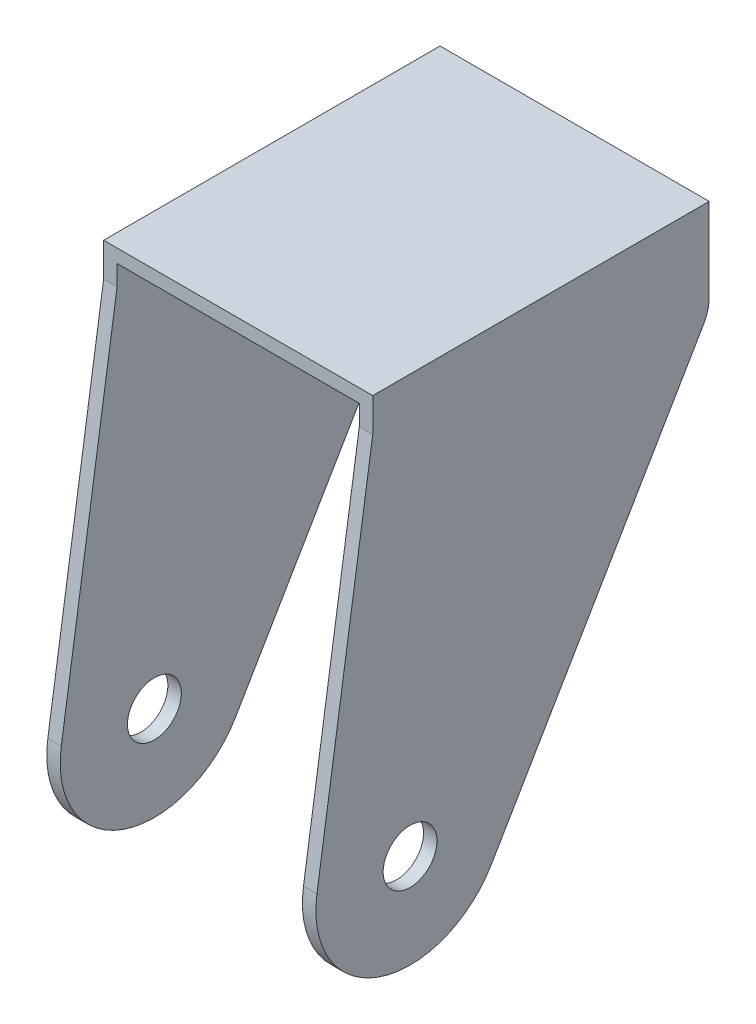
ISO-10303-21;
HEADER;
FILE_DESCRIPTION(('STEP AP214'),'2;1');
FILE_NAME('part.step','',(''),(''),'','','');
FILE_SCHEMA(('AUTOMOTIVE_DESIGN { 1 0 10303 214 1 1 1 1 }'));
ENDSEC;
DATA;
#1=APPLICATION_CONTEXT('core data for automotive mechanical design processes');
#2=APPLICATION_PROTOCOL_DEFINITION('international standard','automotive_design',2000,#1);
#3=PRODUCT_CONTEXT('',#1,'mechanical');
#4=PRODUCT('Part','Part','',(#3));
#5=PRODUCT_RELATED_PRODUCT_CATEGORY('part','',(#4));
#6=PRODUCT_DEFINITION_FORMATION('','',#4);
#7=PRODUCT_DEFINITION_CONTEXT('part definition',#1,'design');
#8=PRODUCT_DEFINITION('design','',#6,#7);
#9=PRODUCT_DEFINITION_SHAPE('','',#8);
#10=(LENGTH_UNIT() NAMED_UNIT(*) SI_UNIT(.MILLI.,.METRE.));
#11=(NAMED_UNIT(*) PLANE_ANGLE_UNIT() SI_UNIT($,.RADIAN.));
#12=(NAMED_UNIT(*) SI_UNIT($,.STERADIAN.) SOLID_ANGLE_UNIT());
#13=UNCERTAINTY_MEASURE_WITH_UNIT(LENGTH_MEASURE(1.E-05),#10,'distance_accuracy_value','');
#14=(GEOMETRIC_REPRESENTATION_CONTEXT(3) GLOBAL_UNCERTAINTY_ASSIGNED_CONTEXT((#13)) GLOBAL_UNIT_ASSIGNED_CONTEXT((#10,
#11,#12)) REPRESENTATION_CONTEXT('',''));
#15=CARTESIAN_POINT('',(0.,0.,0.));
#16=DIRECTION('',(0.,0.,1.));
#17=DIRECTION('',(1.,0.,0.));
#18=AXIS2_PLACEMENT_3D('',#15,#16,#17);
#19=CARTESIAN_POINT('',(0.,60.0885017851408,0.));
#20=DIRECTION('',(0.,1.,0.));
#21=DIRECTION('',(0.,0.,1.));
#22=AXIS2_PLACEMENT_3D('',#19,#20,#21);
#23=PLANE('',#22);
#24=DIRECTION('',(-0.466127174450924,0.,0.884717727435366));
#25=VECTOR('',#24,1.);
#26=CARTESIAN_POINT('',(-19.6951823864534,60.0885017851408,-10.3767104822299));
#27=LINE('',#26,#25);
#28=CARTESIAN_POINT('',(-9.64384241139601,60.0885017851408,-29.4543338172952));
#29=VERTEX_POINT('',#28);
#30=CARTESIAN_POINT('',(-18.,60.0885017851408,-13.5941970196715));
#31=VERTEX_POINT('',#30);
#32=EDGE_CURVE('E236',#29,#31,#27,.T.);
#33=ORIENTED_EDGE('',*,*,#32,.T.);
#34=CARTESIAN_POINT('',(-20.,60.0885017851408,-23.3921559908042));
#35=DIRECTION('',(0.,1.,0.));
#36=DIRECTION('',(0.,0.,1.));
#37=AXIS2_PLACEMENT_3D('',#34,#35,#36);
#38=CIRCLE('',#37,10.);
#39=CARTESIAN_POINT('',(-22.,60.0885017851408,-13.5941970196715));
#40=VERTEX_POINT('',#39);
#41=EDGE_CURVE('E217',#31,#40,#38,.F.);
#42=ORIENTED_EDGE('',*,*,#41,.T.);
#43=DIRECTION('',(-0.466127174450924,0.,-0.884717727435366));
#44=VECTOR('',#43,1.);
#45=CARTESIAN_POINT('',(-11.6138359030825,60.0885017851408,6.11892849681372));
#46=LINE('',#45,#44);
#47=CARTESIAN_POINT('',(-30.356157588604,60.0885017851408,-29.4543338172953));
#48=VERTEX_POINT('',#47);
#49=EDGE_CURVE('E242',#40,#48,#46,.T.);
#50=ORIENTED_EDGE('',*,*,#49,.T.);
#51=CARTESIAN_POINT('',(-20.,60.0885017851408,-23.3921559908042));
#52=DIRECTION('',(0.,1.,0.));
#53=DIRECTION('',(0.,0.,1.));
#54=AXIS2_PLACEMENT_3D('',#51,#52,#53);
#55=CIRCLE('',#54,12.);
#56=EDGE_CURVE('E239',#48,#29,#55,.T.);
#57=ORIENTED_EDGE('',*,*,#56,.T.);
#58=EDGE_LOOP('',(#33,#42,#50,#57));
#59=FACE_BOUND('',#58,.T.);
#60=DIRECTION('',(0.,0.,1.));
#61=VECTOR('',#60,1.);
#62=CARTESIAN_POINT('',(-38.,60.0885017851408,0.));
#63=LINE('',#62,#61);
#64=CARTESIAN_POINT('',(-38.,60.0885017851408,-44.4543338172952));
#65=VERTEX_POINT('',#64);
#66=CARTESIAN_POINT('',(-38.,60.0885017851408,5.54566618270477));
#67=VERTEX_POINT('',#66);
#68=EDGE_CURVE('E11',#65,#67,#63,.T.);
#69=ORIENTED_EDGE('',*,*,#68,.F.);
#70=DIRECTION('',(-1.,0.,0.));
#71=VECTOR('',#70,1.);
#72=CARTESIAN_POINT('',(-40.,60.0885017851408,-44.4543338172952));
#73=LINE('',#72,#71);
#74=CARTESIAN_POINT('',(-2.,60.0885017851408,-44.4543338172952));
#75=VERTEX_POINT('',#74);
#76=EDGE_CURVE('E178',#75,#65,#73,.T.);
#77=ORIENTED_EDGE('',*,*,#76,.F.);
#78=DIRECTION('',(0.,0.,1.));
#79=VECTOR('',#78,1.);
#80=CARTESIAN_POINT('',(-2.,60.0885017851408,0.));
#81=LINE('',#80,#79);
#82=CARTESIAN_POINT('',(-2.,60.0885017851408,5.54566618270477));
#83=VERTEX_POINT('',#82);
#84=EDGE_CURVE('E126',#75,#83,#81,.T.);
#85=ORIENTED_EDGE('',*,*,#84,.T.);
#86=DIRECTION('',(1.,0.,0.));
#87=VECTOR('',#86,1.);
#88=CARTESIAN_POINT('',(-40.,60.0885017851408,5.54566618270477));
#89=LINE('',#88,#87);
#90=EDGE_CURVE('E184',#67,#83,#89,.T.);
#91=ORIENTED_EDGE('',*,*,#90,.F.);
#92=EDGE_LOOP('',(#69,#77,#85,#91));
#93=FACE_BOUND('',#92,.T.);
#94=ADVANCED_FACE('F34',(#59,#93),#23,.F.);
#95=CARTESIAN_POINT('',(-2.,0.,0.));
#96=DIRECTION('',(1.,0.,0.));
#97=DIRECTION('',(0.,0.,-1.));
#98=AXIS2_PLACEMENT_3D('',#95,#96,#97);
#99=PLANE('',#98);
#100=CARTESIAN_POINT('',(-2.,0.,0.));
#101=DIRECTION('',(1.,0.,0.));
#102=DIRECTION('',(0.,0.,-1.));
#103=AXIS2_PLACEMENT_3D('',#100,#101,#102);
#104=CIRCLE('',#103,4.);
#105=CARTESIAN_POINT('',(-2.,0.,-4.00000000000001));
#106=VERTEX_POINT('',#105);
#107=EDGE_CURVE('E266',#106,#106,#104,.T.);
#108=ORIENTED_EDGE('',*,*,#107,.T.);
#109=EDGE_LOOP('',(#108));
#110=FACE_BOUND('',#109,.T.);
#111=ORIENTED_EDGE('',*,*,#84,.F.);
#112=DIRECTION('',(0.,1.,0.));
#113=VECTOR('',#112,1.);
#114=CARTESIAN_POINT('',(-2.,62.0885017851408,-44.4543338172952));
#115=LINE('',#114,#113);
#116=CARTESIAN_POINT('',(-2.,49.7190718356807,-44.4543338172952));
#117=VERTEX_POINT('',#116);
#118=EDGE_CURVE('E109',#117,#75,#115,.T.);
#119=ORIENTED_EDGE('',*,*,#118,.F.);
#120=CARTESIAN_POINT('',(-2.,49.7190718356807,-38.4543338172952));
#121=DIRECTION('',(1.,0.,0.));
#122=DIRECTION('',(0.,0.,1.));
#123=AXIS2_PLACEMENT_3D('',#120,#121,#122);
#124=CIRCLE('',#123,6.);
#125=CARTESIAN_POINT('',(-2.,46.6822168610769,-43.6290330223916));
#126=VERTEX_POINT('',#125);
#127=EDGE_CURVE('E123',#126,#117,#124,.T.);
#128=ORIENTED_EDGE('',*,*,#127,.F.);
#129=DIRECTION('',(0.,0.862449867516056,-0.506142495767287));
#130=VECTOR('',#129,1.);
#131=CARTESIAN_POINT('',(-2.,46.6822168610769,-43.6290330223916));
#132=LINE('',#131,#130);
#133=CARTESIAN_POINT('',(-2.,-7.08599494074203,-12.0742981452248));
#134=VERTEX_POINT('',#133);
#135=EDGE_CURVE('E130',#134,#126,#132,.T.);
#136=ORIENTED_EDGE('',*,*,#135,.F.);
#137=CARTESIAN_POINT('',(-2.,0.,0.));
#138=DIRECTION('',(1.,0.,0.));
#139=DIRECTION('',(0.,0.,-1.));
#140=AXIS2_PLACEMENT_3D('',#137,#138,#139);
#141=CIRCLE('',#140,14.);
#142=CARTESIAN_POINT('',(-2.,2.08850178514077,13.8433435373635));
#143=VERTEX_POINT('',#142);
#144=EDGE_CURVE('E132',#143,#134,#141,.T.);
#145=ORIENTED_EDGE('',*,*,#144,.F.);
#146=DIRECTION('',(0.,-0.988810252668821,0.149178698938627));
#147=VECTOR('',#146,1.);
#148=CARTESIAN_POINT('',(-2.,2.08850178514077,13.8433435373635));
#149=LINE('',#148,#147);
#150=CARTESIAN_POINT('',(-2.,57.0885017851408,5.54566618270477));
#151=VERTEX_POINT('',#150);
#152=EDGE_CURVE('E137',#151,#143,#149,.T.);
#153=ORIENTED_EDGE('',*,*,#152,.F.);
#154=DIRECTION('',(0.,-1.,0.));
#155=VECTOR('',#154,1.);
#156=CARTESIAN_POINT('',(-2.,57.0885017851408,5.54566618270477));
#157=LINE('',#156,#155);
#158=EDGE_CURVE('E127',#83,#151,#157,.T.);
#159=ORIENTED_EDGE('',*,*,#158,.F.);
#160=EDGE_LOOP('',(#111,#119,#128,#136,#145,#153,#159));
#161=FACE_BOUND('',#160,.T.);
#162=ADVANCED_FACE('F122',(#110,#161),#99,.F.);
#163=CARTESIAN_POINT('',(-2.,0.,0.));
#164=DIRECTION('',(1.,0.,0.));
#165=DIRECTION('',(0.,0.,-1.));
#166=AXIS2_PLACEMENT_3D('',#163,#164,#165);
#167=CYLINDRICAL_SURFACE('',#166,14.);
#168=CARTESIAN_POINT('',(0.,0.,0.));
#169=DIRECTION('',(1.,0.,0.));
#170=DIRECTION('',(0.,0.,-1.));
#171=AXIS2_PLACEMENT_3D('',#168,#169,#170);
#172=CIRCLE('',#171,14.);
#173=CARTESIAN_POINT('',(0.,2.08850178514077,13.8433435373635));
#174=VERTEX_POINT('',#173);
#175=CARTESIAN_POINT('',(0.,-7.08599494074203,-12.0742981452248));
#176=VERTEX_POINT('',#175);
#177=EDGE_CURVE('E139',#174,#176,#172,.T.);
#178=ORIENTED_EDGE('',*,*,#177,.F.);
#179=DIRECTION('',(1.,0.,0.));
#180=VECTOR('',#179,1.);
#181=CARTESIAN_POINT('',(-2.,2.08850178514077,13.8433435373635));
#182=LINE('',#181,#180);
#183=EDGE_CURVE('E43',#143,#174,#182,.T.);
#184=ORIENTED_EDGE('',*,*,#183,.F.);
#185=ORIENTED_EDGE('',*,*,#144,.T.);
#186=DIRECTION('',(1.,0.,0.));
#187=VECTOR('',#186,1.);
#188=CARTESIAN_POINT('',(-2.,-7.08599494074203,-12.0742981452248));
#189=LINE('',#188,#187);
#190=EDGE_CURVE('E94',#134,#176,#189,.T.);
#191=ORIENTED_EDGE('',*,*,#190,.T.);
#192=EDGE_LOOP('',(#178,#184,#185,#191));
#193=FACE_BOUND('',#192,.T.);
#194=ADVANCED_FACE('F36',(#193),#167,.T.);
#195=CARTESIAN_POINT('',(-2.,2.08850178514077,13.8433435373635));
#196=DIRECTION('',(0.,0.149178698938627,0.988810252668821));
#197=DIRECTION('',(0.,-0.988810252668821,0.149178698938627));
#198=AXIS2_PLACEMENT_3D('',#195,#196,#197);
#199=PLANE('',#198);
#200=DIRECTION('',(0.,-0.988810252668821,0.149178698938627));
#201=VECTOR('',#200,1.);
#202=CARTESIAN_POINT('',(0.,2.08850178514077,13.8433435373635));
#203=LINE('',#202,#201);
#204=CARTESIAN_POINT('',(0.,57.0885017851408,5.54566618270477));
#205=VERTEX_POINT('',#204);
#206=EDGE_CURVE('E153',#205,#174,#203,.T.);
#207=ORIENTED_EDGE('',*,*,#206,.F.);
#208=DIRECTION('',(1.,0.,0.));
#209=VECTOR('',#208,1.);
#210=CARTESIAN_POINT('',(-2.,57.0885017851408,5.54566618270477));
#211=LINE('',#210,#209);
#212=EDGE_CURVE('E157',#151,#205,#211,.T.);
#213=ORIENTED_EDGE('',*,*,#212,.F.);
#214=ORIENTED_EDGE('',*,*,#152,.T.);
#215=ORIENTED_EDGE('',*,*,#183,.T.);
#216=EDGE_LOOP('',(#207,#213,#214,#215));
#217=FACE_BOUND('',#216,.T.);
#218=ADVANCED_FACE('F169',(#217),#199,.T.);
#219=CARTESIAN_POINT('',(-2.,57.0885017851408,5.54566618270477));
#220=DIRECTION('',(0.,0.,1.));
#221=DIRECTION('',(1.,0.,0.));
#222=AXIS2_PLACEMENT_3D('',#219,#220,#221);
#223=PLANE('',#222);
#224=DIRECTION('',(0.,-1.,0.));
#225=VECTOR('',#224,1.);
#226=CARTESIAN_POINT('',(-38.,57.0885017851408,5.54566618270477));
#227=LINE('',#226,#225);
#228=CARTESIAN_POINT('',(-38.,57.0885017851408,5.54566618270477));
#229=VERTEX_POINT('',#228);
#230=EDGE_CURVE('E220',#67,#229,#227,.T.);
#231=ORIENTED_EDGE('',*,*,#230,.F.);
#232=ORIENTED_EDGE('',*,*,#90,.T.);
#233=ORIENTED_EDGE('',*,*,#158,.T.);
#234=ORIENTED_EDGE('',*,*,#212,.T.);
#235=DIRECTION('',(0.,-1.,0.));
#236=VECTOR('',#235,1.);
#237=CARTESIAN_POINT('',(0.,57.0885017851408,5.54566618270477));
#238=LINE('',#237,#236);
#239=CARTESIAN_POINT('',(0.,62.0885017851408,5.54566618270477));
#240=VERTEX_POINT('',#239);
#241=EDGE_CURVE('E151',#240,#205,#238,.T.);
#242=ORIENTED_EDGE('',*,*,#241,.F.);
#243=DIRECTION('',(1.,0.,0.));
#244=VECTOR('',#243,1.);
#245=CARTESIAN_POINT('',(-2.,62.0885017851408,5.54566618270477));
#246=LINE('',#245,#244);
#247=CARTESIAN_POINT('',(-40.,62.0885017851408,5.54566618270477));
#248=VERTEX_POINT('',#247);
#249=EDGE_CURVE('E160',#248,#240,#246,.T.);
#250=ORIENTED_EDGE('',*,*,#249,.F.);
#251=DIRECTION('',(0.,1.,0.));
#252=VECTOR('',#251,1.);
#253=CARTESIAN_POINT('',(-40.,60.0885017851408,5.54566618270477));
#254=LINE('',#253,#252);
#255=CARTESIAN_POINT('',(-40.,57.0885017851408,5.54566618270477));
#256=VERTEX_POINT('',#255);
#257=EDGE_CURVE('E175',#256,#248,#254,.T.);
#258=ORIENTED_EDGE('',*,*,#257,.F.);
#259=DIRECTION('',(-1.,0.,0.));
#260=VECTOR('',#259,1.);
#261=CARTESIAN_POINT('',(-38.,57.0885017851408,5.54566618270477));
#262=LINE('',#261,#260);
#263=EDGE_CURVE('E199',#229,#256,#262,.T.);
#264=ORIENTED_EDGE('',*,*,#263,.F.);
#265=EDGE_LOOP('',(#231,#232,#233,#234,#242,#250,#258,#264));
#266=FACE_BOUND('',#265,.T.);
#267=ADVANCED_FACE('F317',(#266),#223,.T.);
#268=CARTESIAN_POINT('',(-2.,62.0885017851408,5.54566618270477));
#269=DIRECTION('',(0.,1.,0.));
#270=DIRECTION('',(0.,0.,1.));
#271=AXIS2_PLACEMENT_3D('',#268,#269,#270);
#272=PLANE('',#271);
#273=ORIENTED_EDGE('',*,*,#249,.T.);
#274=DIRECTION('',(0.,0.,1.));
#275=VECTOR('',#274,1.);
#276=CARTESIAN_POINT('',(0.,62.0885017851408,5.54566618270477));
#277=LINE('',#276,#275);
#278=CARTESIAN_POINT('',(0.,62.0885017851408,-44.4543338172952));
#279=VERTEX_POINT('',#278);
#280=EDGE_CURVE('E148',#279,#240,#277,.T.);
#281=ORIENTED_EDGE('',*,*,#280,.F.);
#282=DIRECTION('',(1.,0.,0.));
#283=VECTOR('',#282,1.);
#284=CARTESIAN_POINT('',(-2.,62.0885017851408,-44.4543338172952));
#285=LINE('',#284,#283);
#286=CARTESIAN_POINT('',(-40.,62.0885017851408,-44.4543338172952));
#287=VERTEX_POINT('',#286);
#288=EDGE_CURVE('E116',#287,#279,#285,.T.);
#289=ORIENTED_EDGE('',*,*,#288,.F.);
#290=DIRECTION('',(0.,0.,1.));
#291=VECTOR('',#290,1.);
#292=CARTESIAN_POINT('',(-40.,62.0885017851408,-44.4543338172952));
#293=LINE('',#292,#291);
#294=EDGE_CURVE('E181',#287,#248,#293,.T.);
#295=ORIENTED_EDGE('',*,*,#294,.T.);
#296=EDGE_LOOP('',(#273,#281,#289,#295));
#297=FACE_BOUND('',#296,.T.);
#298=ADVANCED_FACE('F320',(#297),#272,.T.);
#299=CARTESIAN_POINT('',(-2.,62.0885017851408,-44.4543338172952));
#300=DIRECTION('',(0.,0.,-1.));
#301=DIRECTION('',(-1.,0.,0.));
#302=AXIS2_PLACEMENT_3D('',#299,#300,#301);
#303=PLANE('',#302);
#304=ORIENTED_EDGE('',*,*,#288,.T.);
#305=DIRECTION('',(0.,1.,0.));
#306=VECTOR('',#305,1.);
#307=CARTESIAN_POINT('',(0.,62.0885017851408,-44.4543338172952));
#308=LINE('',#307,#306);
#309=CARTESIAN_POINT('',(0.,49.7190718356807,-44.4543338172952));
#310=VERTEX_POINT('',#309);
#311=EDGE_CURVE('E111',#310,#279,#308,.T.);
#312=ORIENTED_EDGE('',*,*,#311,.F.);
#313=DIRECTION('',(1.,0.,0.));
#314=VECTOR('',#313,1.);
#315=CARTESIAN_POINT('',(-2.,49.7190718356807,-44.4543338172952));
#316=LINE('',#315,#314);
#317=EDGE_CURVE('E104',#117,#310,#316,.T.);
#318=ORIENTED_EDGE('',*,*,#317,.F.);
#319=ORIENTED_EDGE('',*,*,#118,.T.);
#320=ORIENTED_EDGE('',*,*,#76,.T.);
#321=DIRECTION('',(0.,1.,0.));
#322=VECTOR('',#321,1.);
#323=CARTESIAN_POINT('',(-38.,62.0885017851408,-44.4543338172952));
#324=LINE('',#323,#322);
#325=CARTESIAN_POINT('',(-38.,49.7190718356807,-44.4543338172952));
#326=VERTEX_POINT('',#325);
#327=EDGE_CURVE('E223',#326,#65,#324,.T.);
#328=ORIENTED_EDGE('',*,*,#327,.F.);
#329=DIRECTION('',(-1.,0.,0.));
#330=VECTOR('',#329,1.);
#331=CARTESIAN_POINT('',(-38.,49.7190718356807,-44.4543338172952));
#332=LINE('',#331,#330);
#333=CARTESIAN_POINT('',(-40.,49.7190718356807,-44.4543338172952));
#334=VERTEX_POINT('',#333);
#335=EDGE_CURVE('E196',#326,#334,#332,.T.);
#336=ORIENTED_EDGE('',*,*,#335,.T.);
#337=DIRECTION('',(0.,1.,0.));
#338=VECTOR('',#337,1.);
#339=CARTESIAN_POINT('',(-40.,60.0885017851408,-44.4543338172952));
#340=LINE('',#339,#338);
#341=EDGE_CURVE('E174',#334,#287,#340,.T.);
#342=ORIENTED_EDGE('',*,*,#341,.T.);
#343=EDGE_LOOP('',(#304,#312,#318,#319,#320,#328,#336,#342));
#344=FACE_BOUND('',#343,.T.);
#345=ADVANCED_FACE('F106',(#344),#303,.T.);
#346=CARTESIAN_POINT('',(-2.,49.7190718356807,-38.4543338172952));
#347=DIRECTION('',(1.,0.,0.));
#348=DIRECTION('',(0.,0.,-1.));
#349=AXIS2_PLACEMENT_3D('',#346,#347,#348);
#350=CYLINDRICAL_SURFACE('',#349,6.);
#351=CARTESIAN_POINT('',(0.,49.7190718356807,-38.4543338172952));
#352=DIRECTION('',(1.,0.,0.));
#353=DIRECTION('',(0.,0.,1.));
#354=AXIS2_PLACEMENT_3D('',#351,#352,#353);
#355=CIRCLE('',#354,6.);
#356=CARTESIAN_POINT('',(0.,46.6822168610769,-43.6290330223916));
#357=VERTEX_POINT('',#356);
#358=EDGE_CURVE('E145',#357,#310,#355,.T.);
#359=ORIENTED_EDGE('',*,*,#358,.F.);
#360=DIRECTION('',(1.,0.,0.));
#361=VECTOR('',#360,1.);
#362=CARTESIAN_POINT('',(-2.,46.6822168610769,-43.6290330223916));
#363=LINE('',#362,#361);
#364=EDGE_CURVE('E117',#126,#357,#363,.T.);
#365=ORIENTED_EDGE('',*,*,#364,.F.);
#366=ORIENTED_EDGE('',*,*,#127,.T.);
#367=ORIENTED_EDGE('',*,*,#317,.T.);
#368=EDGE_LOOP('',(#359,#365,#366,#367));
#369=FACE_BOUND('',#368,.T.);
#370=ADVANCED_FACE('F129',(#369),#350,.T.);
#371=CARTESIAN_POINT('',(-2.,46.6822168610769,-43.6290330223916));
#372=DIRECTION('',(0.,-0.506142495767287,-0.862449867516056));
#373=DIRECTION('',(0.,0.862449867516056,-0.506142495767287));
#374=AXIS2_PLACEMENT_3D('',#371,#372,#373);
#375=PLANE('',#374);
#376=DIRECTION('',(0.,0.862449867516056,-0.506142495767287));
#377=VECTOR('',#376,1.);
#378=CARTESIAN_POINT('',(0.,46.6822168610769,-43.6290330223916));
#379=LINE('',#378,#377);
#380=EDGE_CURVE('E142',#176,#357,#379,.T.);
#381=ORIENTED_EDGE('',*,*,#380,.F.);
#382=ORIENTED_EDGE('',*,*,#190,.F.);
#383=ORIENTED_EDGE('',*,*,#135,.T.);
#384=ORIENTED_EDGE('',*,*,#364,.T.);
#385=EDGE_LOOP('',(#381,#382,#383,#384));
#386=FACE_BOUND('',#385,.T.);
#387=ADVANCED_FACE('F164',(#386),#375,.T.);
#388=CARTESIAN_POINT('',(0.,0.,0.));
#389=DIRECTION('',(1.,0.,0.));
#390=DIRECTION('',(0.,0.,-1.));
#391=AXIS2_PLACEMENT_3D('',#388,#389,#390);
#392=PLANE('',#391);
#393=CARTESIAN_POINT('',(0.,0.,0.));
#394=DIRECTION('',(1.,0.,0.));
#395=DIRECTION('',(0.,0.,-1.));
#396=AXIS2_PLACEMENT_3D('',#393,#394,#395);
#397=CIRCLE('',#396,4.);
#398=CARTESIAN_POINT('',(0.,0.,-4.00000000000001));
#399=VERTEX_POINT('',#398);
#400=EDGE_CURVE('E269',#399,#399,#397,.T.);
#401=ORIENTED_EDGE('',*,*,#400,.F.);
#402=EDGE_LOOP('',(#401));
#403=FACE_BOUND('',#402,.T.);
#404=ORIENTED_EDGE('',*,*,#241,.T.);
#405=ORIENTED_EDGE('',*,*,#206,.T.);
#406=ORIENTED_EDGE('',*,*,#177,.T.);
#407=ORIENTED_EDGE('',*,*,#380,.T.);
#408=ORIENTED_EDGE('',*,*,#358,.T.);
#409=ORIENTED_EDGE('',*,*,#311,.T.);
#410=ORIENTED_EDGE('',*,*,#280,.T.);
#411=EDGE_LOOP('',(#404,#405,#406,#407,#408,#409,#410));
#412=FACE_BOUND('',#411,.T.);
#413=ADVANCED_FACE('F166',(#403,#412),#392,.T.);
#414=CARTESIAN_POINT('',(-40.,60.0885017851408,-44.4543338172952));
#415=DIRECTION('',(-1.,0.,0.));
#416=DIRECTION('',(0.,0.,1.));
#417=AXIS2_PLACEMENT_3D('',#414,#415,#416);
#418=PLANE('',#417);
#419=CARTESIAN_POINT('',(-40.,0.,0.));
#420=DIRECTION('',(-1.,0.,0.));
#421=DIRECTION('',(0.,0.,1.));
#422=AXIS2_PLACEMENT_3D('',#419,#420,#421);
#423=CIRCLE('',#422,4.);
#424=CARTESIAN_POINT('',(-40.,0.,4.));
#425=VERTEX_POINT('',#424);
#426=EDGE_CURVE('E272',#425,#425,#423,.T.);
#427=ORIENTED_EDGE('',*,*,#426,.F.);
#428=EDGE_LOOP('',(#427));
#429=FACE_BOUND('',#428,.T.);
#430=ORIENTED_EDGE('',*,*,#294,.F.);
#431=ORIENTED_EDGE('',*,*,#341,.F.);
#432=CARTESIAN_POINT('',(-40.,49.7190718356807,-38.4543338172952));
#433=DIRECTION('',(1.,0.,0.));
#434=DIRECTION('',(0.,0.,1.));
#435=AXIS2_PLACEMENT_3D('',#432,#433,#434);
#436=CIRCLE('',#435,6.);
#437=CARTESIAN_POINT('',(-40.,46.6822168610769,-43.6290330223916));
#438=VERTEX_POINT('',#437);
#439=EDGE_CURVE('E208',#438,#334,#436,.T.);
#440=ORIENTED_EDGE('',*,*,#439,.F.);
#441=DIRECTION('',(0.,0.862449867516056,-0.506142495767287));
#442=VECTOR('',#441,1.);
#443=CARTESIAN_POINT('',(-40.,46.6822168610769,-43.6290330223916));
#444=LINE('',#443,#442);
#445=CARTESIAN_POINT('',(-40.,-7.08599494074203,-12.0742981452248));
#446=VERTEX_POINT('',#445);
#447=EDGE_CURVE('E211',#446,#438,#444,.T.);
#448=ORIENTED_EDGE('',*,*,#447,.F.);
#449=CARTESIAN_POINT('',(-40.,0.,0.));
#450=DIRECTION('',(1.,0.,0.));
#451=DIRECTION('',(0.,0.,-1.));
#452=AXIS2_PLACEMENT_3D('',#449,#450,#451);
#453=CIRCLE('',#452,14.);
#454=CARTESIAN_POINT('',(-40.,2.08850178514077,13.8433435373635));
#455=VERTEX_POINT('',#454);
#456=EDGE_CURVE('E214',#455,#446,#453,.T.);
#457=ORIENTED_EDGE('',*,*,#456,.F.);
#458=DIRECTION('',(0.,-0.988810252668821,0.149178698938627));
#459=VECTOR('',#458,1.);
#460=CARTESIAN_POINT('',(-40.,2.08850178514077,13.8433435373635));
#461=LINE('',#460,#459);
#462=EDGE_CURVE('E204',#256,#455,#461,.T.);
#463=ORIENTED_EDGE('',*,*,#462,.F.);
#464=ORIENTED_EDGE('',*,*,#257,.T.);
#465=EDGE_LOOP('',(#430,#431,#440,#448,#457,#463,#464));
#466=FACE_BOUND('',#465,.T.);
#467=ADVANCED_FACE('F308',(#429,#466),#418,.T.);
#468=CARTESIAN_POINT('',(-38.,0.,0.));
#469=DIRECTION('',(-1.,0.,0.));
#470=DIRECTION('',(0.,0.,-1.));
#471=AXIS2_PLACEMENT_3D('',#468,#469,#470);
#472=PLANE('',#471);
#473=CARTESIAN_POINT('',(-38.,0.,0.));
#474=DIRECTION('',(-1.,0.,0.));
#475=DIRECTION('',(0.,0.,1.));
#476=AXIS2_PLACEMENT_3D('',#473,#474,#475);
#477=CIRCLE('',#476,4.);
#478=CARTESIAN_POINT('',(-38.,0.,4.));
#479=VERTEX_POINT('',#478);
#480=EDGE_CURVE('E38',#479,#479,#477,.T.);
#481=ORIENTED_EDGE('',*,*,#480,.T.);
#482=EDGE_LOOP('',(#481));
#483=FACE_BOUND('',#482,.T.);
#484=ORIENTED_EDGE('',*,*,#327,.T.);
#485=ORIENTED_EDGE('',*,*,#68,.T.);
#486=ORIENTED_EDGE('',*,*,#230,.T.);
#487=DIRECTION('',(0.,-0.988810252668821,0.149178698938627));
#488=VECTOR('',#487,1.);
#489=CARTESIAN_POINT('',(-38.,2.08850178514077,13.8433435373635));
#490=LINE('',#489,#488);
#491=CARTESIAN_POINT('',(-38.,2.08850178514077,13.8433435373635));
#492=VERTEX_POINT('',#491);
#493=EDGE_CURVE('E193',#229,#492,#490,.T.);
#494=ORIENTED_EDGE('',*,*,#493,.T.);
#495=CARTESIAN_POINT('',(-38.,0.,0.));
#496=DIRECTION('',(1.,0.,0.));
#497=DIRECTION('',(0.,0.,-1.));
#498=AXIS2_PLACEMENT_3D('',#495,#496,#497);
#499=CIRCLE('',#498,14.);
#500=CARTESIAN_POINT('',(-38.,-7.08599494074203,-12.0742981452248));
#501=VERTEX_POINT('',#500);
#502=EDGE_CURVE('E207',#492,#501,#499,.T.);
#503=ORIENTED_EDGE('',*,*,#502,.T.);
#504=DIRECTION('',(0.,0.862449867516056,-0.506142495767287));
#505=VECTOR('',#504,1.);
#506=CARTESIAN_POINT('',(-38.,46.6822168610769,-43.6290330223916));
#507=LINE('',#506,#505);
#508=CARTESIAN_POINT('',(-38.,46.6822168610769,-43.6290330223916));
#509=VERTEX_POINT('',#508);
#510=EDGE_CURVE('E229',#501,#509,#507,.T.);
#511=ORIENTED_EDGE('',*,*,#510,.T.);
#512=CARTESIAN_POINT('',(-38.,49.7190718356807,-38.4543338172952));
#513=DIRECTION('',(1.,0.,0.));
#514=DIRECTION('',(0.,0.,1.));
#515=AXIS2_PLACEMENT_3D('',#512,#513,#514);
#516=CIRCLE('',#515,6.);
#517=EDGE_CURVE('E226',#509,#326,#516,.T.);
#518=ORIENTED_EDGE('',*,*,#517,.T.);
#519=EDGE_LOOP('',(#484,#485,#486,#494,#503,#511,#518));
#520=FACE_BOUND('',#519,.T.);
#521=ADVANCED_FACE('F279',(#483,#520),#472,.F.);
#522=CARTESIAN_POINT('',(-38.,0.,0.));
#523=DIRECTION('',(-1.,0.,0.));
#524=DIRECTION('',(0.,0.,-1.));
#525=AXIS2_PLACEMENT_3D('',#522,#523,#524);
#526=CYLINDRICAL_SURFACE('',#525,14.);
#527=ORIENTED_EDGE('',*,*,#456,.T.);
#528=DIRECTION('',(-1.,0.,0.));
#529=VECTOR('',#528,1.);
#530=CARTESIAN_POINT('',(-38.,-7.08599494074203,-12.0742981452248));
#531=LINE('',#530,#529);
#532=EDGE_CURVE('E189',#501,#446,#531,.T.);
#533=ORIENTED_EDGE('',*,*,#532,.F.);
#534=ORIENTED_EDGE('',*,*,#502,.F.);
#535=DIRECTION('',(-1.,0.,0.));
#536=VECTOR('',#535,1.);
#537=CARTESIAN_POINT('',(-38.,2.08850178514077,13.8433435373635));
#538=LINE('',#537,#536);
#539=EDGE_CURVE('E185',#492,#455,#538,.T.);
#540=ORIENTED_EDGE('',*,*,#539,.T.);
#541=EDGE_LOOP('',(#527,#533,#534,#540));
#542=FACE_BOUND('',#541,.T.);
#543=ADVANCED_FACE('F306',(#542),#526,.T.);
#544=CARTESIAN_POINT('',(-38.,2.08850178514077,13.8433435373635));
#545=DIRECTION('',(0.,0.149178698938627,0.988810252668821));
#546=DIRECTION('',(0.,-0.988810252668821,0.149178698938627));
#547=AXIS2_PLACEMENT_3D('',#544,#545,#546);
#548=PLANE('',#547);
#549=ORIENTED_EDGE('',*,*,#462,.T.);
#550=ORIENTED_EDGE('',*,*,#539,.F.);
#551=ORIENTED_EDGE('',*,*,#493,.F.);
#552=ORIENTED_EDGE('',*,*,#263,.T.);
#553=EDGE_LOOP('',(#549,#550,#551,#552));
#554=FACE_BOUND('',#553,.T.);
#555=ADVANCED_FACE('F355',(#554),#548,.T.);
#556=CARTESIAN_POINT('',(-38.,49.7190718356807,-38.4543338172952));
#557=DIRECTION('',(-1.,0.,0.));
#558=DIRECTION('',(0.,0.,-1.));
#559=AXIS2_PLACEMENT_3D('',#556,#557,#558);
#560=CYLINDRICAL_SURFACE('',#559,6.);
#561=ORIENTED_EDGE('',*,*,#439,.T.);
#562=ORIENTED_EDGE('',*,*,#335,.F.);
#563=ORIENTED_EDGE('',*,*,#517,.F.);
#564=DIRECTION('',(-1.,0.,0.));
#565=VECTOR('',#564,1.);
#566=CARTESIAN_POINT('',(-38.,46.6822168610769,-43.6290330223916));
#567=LINE('',#566,#565);
#568=EDGE_CURVE('E192',#509,#438,#567,.T.);
#569=ORIENTED_EDGE('',*,*,#568,.T.);
#570=EDGE_LOOP('',(#561,#562,#563,#569));
#571=FACE_BOUND('',#570,.T.);
#572=ADVANCED_FACE('F362',(#571),#560,.T.);
#573=CARTESIAN_POINT('',(-38.,46.6822168610769,-43.6290330223916));
#574=DIRECTION('',(0.,-0.506142495767287,-0.862449867516056));
#575=DIRECTION('',(0.,0.862449867516056,-0.506142495767287));
#576=AXIS2_PLACEMENT_3D('',#573,#574,#575);
#577=PLANE('',#576);
#578=ORIENTED_EDGE('',*,*,#447,.T.);
#579=ORIENTED_EDGE('',*,*,#568,.F.);
#580=ORIENTED_EDGE('',*,*,#510,.F.);
#581=ORIENTED_EDGE('',*,*,#532,.T.);
#582=EDGE_LOOP('',(#578,#579,#580,#581));
#583=FACE_BOUND('',#582,.T.);
#584=ADVANCED_FACE('F370',(#583),#577,.T.);
#585=CARTESIAN_POINT('',(-20.,58.0885017851408,-23.3921559908042));
#586=DIRECTION('',(0.,1.,0.));
#587=DIRECTION('',(0.,0.,1.));
#588=AXIS2_PLACEMENT_3D('',#585,#586,#587);
#589=CYLINDRICAL_SURFACE('',#588,10.);
#590=ORIENTED_EDGE('',*,*,#41,.F.);
#591=DIRECTION('',(0.,1.,0.));
#592=VECTOR('',#591,1.);
#593=CARTESIAN_POINT('',(-18.,58.0885017851408,-13.5941970196715));
#594=LINE('',#593,#592);
#595=CARTESIAN_POINT('',(-18.,58.0885017851408,-13.5941970196715));
#596=VERTEX_POINT('',#595);
#597=EDGE_CURVE('E245',#596,#31,#594,.T.);
#598=ORIENTED_EDGE('',*,*,#597,.F.);
#599=CARTESIAN_POINT('',(-20.,58.0885017851408,-23.3921559908042));
#600=DIRECTION('',(0.,-1.,0.));
#601=DIRECTION('',(0.,0.,1.));
#602=AXIS2_PLACEMENT_3D('',#599,#600,#601);
#603=CIRCLE('',#602,10.);
#604=CARTESIAN_POINT('',(-22.,58.0885017851408,-13.5941970196715));
#605=VERTEX_POINT('',#604);
#606=EDGE_CURVE('E263',#596,#605,#603,.T.);
#607=ORIENTED_EDGE('',*,*,#606,.T.);
#608=DIRECTION('',(0.,1.,0.));
#609=VECTOR('',#608,1.);
#610=CARTESIAN_POINT('',(-22.,58.0885017851408,-13.5941970196715));
#611=LINE('',#610,#609);
#612=EDGE_CURVE('E246',#605,#40,#611,.T.);
#613=ORIENTED_EDGE('',*,*,#612,.T.);
#614=EDGE_LOOP('',(#590,#598,#607,#613));
#615=FACE_BOUND('',#614,.T.);
#616=ADVANCED_FACE('F377',(#615),#589,.F.);
#617=CARTESIAN_POINT('',(-18.,58.0885017851408,-13.5941970196715));
#618=DIRECTION('',(-0.884717727435366,0.,-0.466127174450924));
#619=DIRECTION('',(-0.466127174450924,0.,0.884717727435366));
#620=AXIS2_PLACEMENT_3D('',#617,#618,#619);
#621=PLANE('',#620);
#622=ORIENTED_EDGE('',*,*,#32,.F.);
#623=DIRECTION('',(0.,1.,0.));
#624=VECTOR('',#623,1.);
#625=CARTESIAN_POINT('',(-9.64384241139601,58.0885017851408,-29.4543338172952));
#626=LINE('',#625,#624);
#627=CARTESIAN_POINT('',(-9.64384241139601,58.0885017851408,-29.4543338172952));
#628=VERTEX_POINT('',#627);
#629=EDGE_CURVE('E251',#628,#29,#626,.T.);
#630=ORIENTED_EDGE('',*,*,#629,.F.);
#631=DIRECTION('',(-0.466127174450924,0.,0.884717727435365));
#632=VECTOR('',#631,1.);
#633=CARTESIAN_POINT('',(-18.,58.0885017851408,-13.5941970196715));
#634=LINE('',#633,#632);
#635=EDGE_CURVE('E249',#628,#596,#634,.T.);
#636=ORIENTED_EDGE('',*,*,#635,.T.);
#637=ORIENTED_EDGE('',*,*,#597,.T.);
#638=EDGE_LOOP('',(#622,#630,#636,#637));
#639=FACE_BOUND('',#638,.T.);
#640=ADVANCED_FACE('F384',(#639),#621,.T.);
#641=CARTESIAN_POINT('',(-20.,58.0885017851408,-23.3921559908042));
#642=DIRECTION('',(0.,1.,0.));
#643=DIRECTION('',(0.,0.,1.));
#644=AXIS2_PLACEMENT_3D('',#641,#642,#643);
#645=CYLINDRICAL_SURFACE('',#644,12.);
#646=ORIENTED_EDGE('',*,*,#56,.F.);
#647=DIRECTION('',(0.,1.,0.));
#648=VECTOR('',#647,1.);
#649=CARTESIAN_POINT('',(-30.356157588604,58.0885017851408,-29.4543338172953));
#650=LINE('',#649,#648);
#651=CARTESIAN_POINT('',(-30.356157588604,58.0885017851408,-29.4543338172953));
#652=VERTEX_POINT('',#651);
#653=EDGE_CURVE('E50',#652,#48,#650,.T.);
#654=ORIENTED_EDGE('',*,*,#653,.F.);
#655=CARTESIAN_POINT('',(-20.,58.0885017851408,-23.3921559908042));
#656=DIRECTION('',(0.,1.,0.));
#657=DIRECTION('',(0.,0.,1.));
#658=AXIS2_PLACEMENT_3D('',#655,#656,#657);
#659=CIRCLE('',#658,12.);
#660=EDGE_CURVE('E258',#652,#628,#659,.T.);
#661=ORIENTED_EDGE('',*,*,#660,.T.);
#662=ORIENTED_EDGE('',*,*,#629,.T.);
#663=EDGE_LOOP('',(#646,#654,#661,#662));
#664=FACE_BOUND('',#663,.T.);
#665=ADVANCED_FACE('F393',(#664),#645,.T.);
#666=CARTESIAN_POINT('',(-22.,58.0885017851408,-13.5941970196715));
#667=DIRECTION('',(0.884717727435366,0.,-0.466127174450924));
#668=DIRECTION('',(-0.466127174450924,0.,-0.884717727435366));
#669=AXIS2_PLACEMENT_3D('',#666,#667,#668);
#670=PLANE('',#669);
#671=ORIENTED_EDGE('',*,*,#49,.F.);
#672=ORIENTED_EDGE('',*,*,#612,.F.);
#673=DIRECTION('',(-0.466127174450924,0.,-0.884717727435365));
#674=VECTOR('',#673,1.);
#675=CARTESIAN_POINT('',(-22.,58.0885017851408,-13.5941970196715));
#676=LINE('',#675,#674);
#677=EDGE_CURVE('E261',#605,#652,#676,.T.);
#678=ORIENTED_EDGE('',*,*,#677,.T.);
#679=ORIENTED_EDGE('',*,*,#653,.T.);
#680=EDGE_LOOP('',(#671,#672,#678,#679));
#681=FACE_BOUND('',#680,.T.);
#682=ADVANCED_FACE('F292',(#681),#670,.T.);
#683=CARTESIAN_POINT('',(-20.,58.0885017851408,-23.3921559908042));
#684=DIRECTION('',(0.,1.,0.));
#685=DIRECTION('',(0.,0.,1.));
#686=AXIS2_PLACEMENT_3D('',#683,#684,#685);
#687=PLANE('',#686);
#688=ORIENTED_EDGE('',*,*,#606,.F.);
#689=ORIENTED_EDGE('',*,*,#635,.F.);
#690=ORIENTED_EDGE('',*,*,#660,.F.);
#691=ORIENTED_EDGE('',*,*,#677,.F.);
#692=EDGE_LOOP('',(#688,#689,#690,#691));
#693=FACE_BOUND('',#692,.T.);
#694=ADVANCED_FACE('F285',(#693),#687,.F.);
#695=CARTESIAN_POINT('',(4.00000000000001,0.,0.));
#696=DIRECTION('',(-1.,0.,0.));
#697=DIRECTION('',(0.,0.,1.));
#698=AXIS2_PLACEMENT_3D('',#695,#696,#697);
#699=CYLINDRICAL_SURFACE('',#698,4.);
#700=ORIENTED_EDGE('',*,*,#426,.T.);
#701=EDGE_LOOP('',(#700));
#702=FACE_BOUND('',#701,.T.);
#703=ORIENTED_EDGE('',*,*,#480,.F.);
#704=EDGE_LOOP('',(#703));
#705=FACE_BOUND('',#704,.T.);
#706=ADVANCED_FACE('F282',(#702,#705),#699,.F.);
#707=ORIENTED_EDGE('',*,*,#400,.T.);
#708=EDGE_LOOP('',(#707));
#709=FACE_BOUND('',#708,.T.);
#710=ORIENTED_EDGE('',*,*,#107,.F.);
#711=EDGE_LOOP('',(#710));
#712=FACE_BOUND('',#711,.T.);
#713=ADVANCED_FACE('F284',(#709,#712),#699,.F.);
#714=CLOSED_SHELL('',(#94,#162,#194,#218,#267,#298,#345,#370,#387,#413,#467,#521,#543,#555,#572,
#584,#616,#640,#665,#682,#694,#706,#713));
#715=MANIFOLD_SOLID_BREP('B2',#714);
#716=ADVANCED_BREP_SHAPE_REPRESENTATION('',(#18,#715),#14);
#717=SHAPE_DEFINITION_REPRESENTATION(#9,#716);
ENDSEC;
END-ISO-10303-21;
